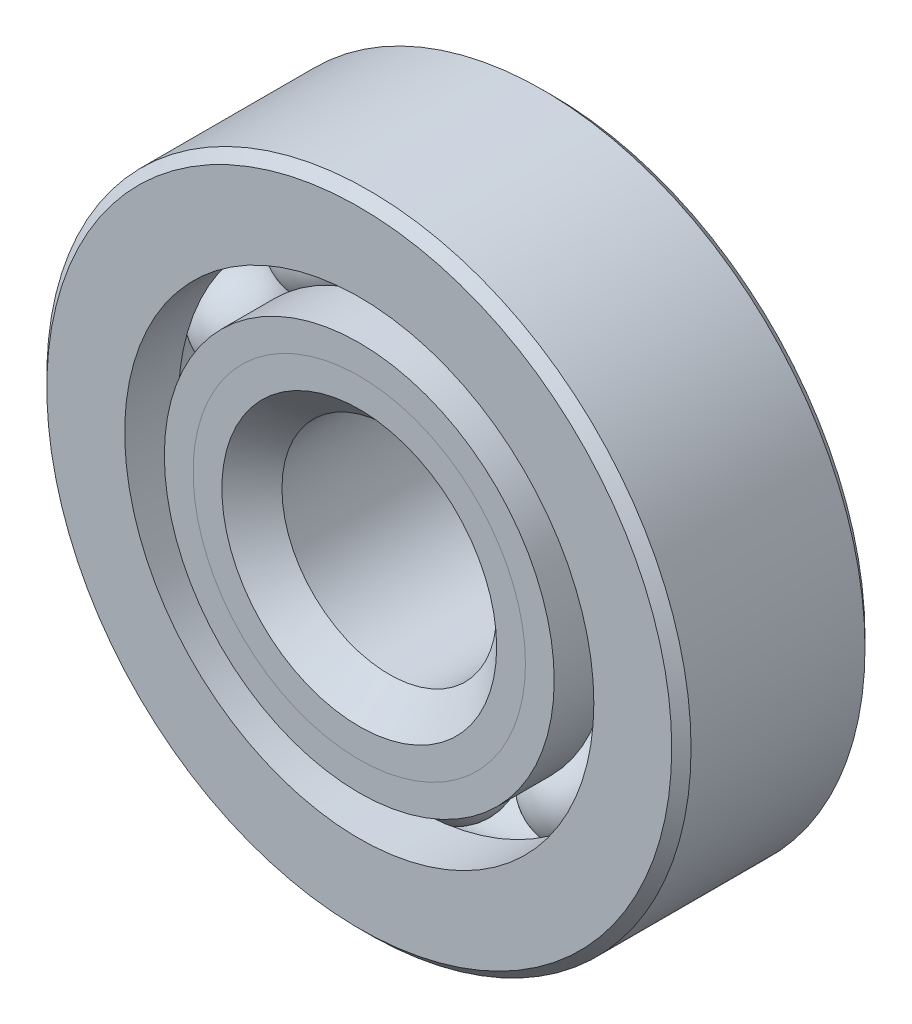
ISO-10303-21;
HEADER;
FILE_DESCRIPTION(('STEP AP214'),'2;1');
FILE_NAME('part.step','',(''),(''),'','','');
FILE_SCHEMA(('AUTOMOTIVE_DESIGN { 1 0 10303 214 1 1 1 1 }'));
ENDSEC;
DATA;
#1=APPLICATION_CONTEXT('core data for automotive mechanical design processes');
#2=APPLICATION_PROTOCOL_DEFINITION('international standard','automotive_design',2000,#1);
#3=PRODUCT_CONTEXT('',#1,'mechanical');
#4=PRODUCT('Part','Part','',(#3));
#5=PRODUCT_RELATED_PRODUCT_CATEGORY('part','',(#4));
#6=PRODUCT_DEFINITION_FORMATION('','',#4);
#7=PRODUCT_DEFINITION_CONTEXT('part definition',#1,'design');
#8=PRODUCT_DEFINITION('design','',#6,#7);
#9=PRODUCT_DEFINITION_SHAPE('','',#8);
#10=(LENGTH_UNIT() NAMED_UNIT(*) SI_UNIT(.MILLI.,.METRE.));
#11=(NAMED_UNIT(*) PLANE_ANGLE_UNIT() SI_UNIT($,.RADIAN.));
#12=(NAMED_UNIT(*) SI_UNIT($,.STERADIAN.) SOLID_ANGLE_UNIT());
#13=UNCERTAINTY_MEASURE_WITH_UNIT(LENGTH_MEASURE(1.E-05),#10,'distance_accuracy_value','');
#14=(GEOMETRIC_REPRESENTATION_CONTEXT(3) GLOBAL_UNCERTAINTY_ASSIGNED_CONTEXT((#13)) GLOBAL_UNIT_ASSIGNED_CONTEXT((#10,
#11,#12)) REPRESENTATION_CONTEXT('',''));
#15=CARTESIAN_POINT('',(0.,0.,0.));
#16=DIRECTION('',(0.,0.,1.));
#17=DIRECTION('',(1.,0.,0.));
#18=AXIS2_PLACEMENT_3D('',#15,#16,#17);
#19=CARTESIAN_POINT('',(-5.87785252292463,8.09016994374955,0.));
#20=DIRECTION('',(0.,0.,1.));
#21=DIRECTION('',(-0.587785252292462,0.809016994374955,0.));
#22=AXIS2_PLACEMENT_3D('',#19,#20,#21);
#23=SPHERICAL_SURFACE('',#22,2.20274170204251);
#24=CARTESIAN_POINT('',(-5.87785252292463,8.09016994374955,2.20274170204251));
#25=VERTEX_POINT('',#24);
#26=VERTEX_LOOP('',#25);
#27=FACE_BOUND('',#26,.T.);
#28=ADVANCED_FACE('F37',(#27),#23,.T.);
#29=CLOSED_SHELL('',(#28));
#30=MANIFOLD_SOLID_BREP('B2',#29);
#31=CARTESIAN_POINT('',(-9.5105651629515,3.09016994374958,0.));
#32=DIRECTION('',(0.,0.,1.));
#33=DIRECTION('',(-0.95105651629515,0.309016994374958,0.));
#34=AXIS2_PLACEMENT_3D('',#31,#32,#33);
#35=SPHERICAL_SURFACE('',#34,2.20274170204251);
#36=CARTESIAN_POINT('',(-9.5105651629515,3.09016994374958,2.20274170204251));
#37=VERTEX_POINT('',#36);
#38=VERTEX_LOOP('',#37);
#39=FACE_BOUND('',#38,.T.);
#40=ADVANCED_FACE('F68',(#39),#35,.T.);
#41=CLOSED_SHELL('',(#40));
#42=MANIFOLD_SOLID_BREP('B6',#41);
#43=CARTESIAN_POINT('',(-9.51056516295157,-3.09016994374938,0.));
#44=DIRECTION('',(0.,0.,1.));
#45=DIRECTION('',(-0.951056516295157,-0.309016994374938,0.));
#46=AXIS2_PLACEMENT_3D('',#43,#44,#45);
#47=SPHERICAL_SURFACE('',#46,2.20274170204251);
#48=CARTESIAN_POINT('',(-9.51056516295157,-3.09016994374938,2.20274170204251));
#49=VERTEX_POINT('',#48);
#50=VERTEX_LOOP('',#49);
#51=FACE_BOUND('',#50,.T.);
#52=ADVANCED_FACE('F99',(#51),#47,.T.);
#53=CLOSED_SHELL('',(#52));
#54=MANIFOLD_SOLID_BREP('B33',#53);
#55=CARTESIAN_POINT('',(-5.8778525229248,-8.09016994374942,0.));
#56=DIRECTION('',(0.,0.,1.));
#57=DIRECTION('',(-0.58778525229248,-0.809016994374942,0.));
#58=AXIS2_PLACEMENT_3D('',#55,#56,#57);
#59=SPHERICAL_SURFACE('',#58,2.20274170204251);
#60=CARTESIAN_POINT('',(-5.8778525229248,-8.09016994374942,2.20274170204251));
#61=VERTEX_POINT('',#60);
#62=VERTEX_LOOP('',#61);
#63=FACE_BOUND('',#62,.T.);
#64=ADVANCED_FACE('F130',(#63),#59,.T.);
#65=CLOSED_SHELL('',(#64));
#66=MANIFOLD_SOLID_BREP('B64',#65);
#67=CARTESIAN_POINT('',(0.,-10.,0.));
#68=DIRECTION('',(0.,0.,1.));
#69=DIRECTION('',(0.,-1.,0.));
#70=AXIS2_PLACEMENT_3D('',#67,#68,#69);
#71=SPHERICAL_SURFACE('',#70,2.20274170204251);
#72=CARTESIAN_POINT('',(0.,-10.,2.20274170204251));
#73=VERTEX_POINT('',#72);
#74=VERTEX_LOOP('',#73);
#75=FACE_BOUND('',#74,.T.);
#76=ADVANCED_FACE('F161',(#75),#71,.T.);
#77=CLOSED_SHELL('',(#76));
#78=MANIFOLD_SOLID_BREP('B95',#77);
#79=CARTESIAN_POINT('',(5.87785252292469,-8.09016994374951,0.));
#80=DIRECTION('',(0.,0.,1.));
#81=DIRECTION('',(0.587785252292469,-0.809016994374951,0.));
#82=AXIS2_PLACEMENT_3D('',#79,#80,#81);
#83=SPHERICAL_SURFACE('',#82,2.20274170204251);
#84=CARTESIAN_POINT('',(5.87785252292469,-8.09016994374951,2.20274170204251));
#85=VERTEX_POINT('',#84);
#86=VERTEX_LOOP('',#85);
#87=FACE_BOUND('',#86,.T.);
#88=ADVANCED_FACE('F192',(#87),#83,.T.);
#89=CLOSED_SHELL('',(#88));
#90=MANIFOLD_SOLID_BREP('B126',#89);
#91=CARTESIAN_POINT('',(9.51056516295152,-3.09016994374952,0.));
#92=DIRECTION('',(0.,0.,1.));
#93=DIRECTION('',(0.951056516295152,-0.309016994374952,0.));
#94=AXIS2_PLACEMENT_3D('',#91,#92,#93);
#95=SPHERICAL_SURFACE('',#94,2.20274170204251);
#96=CARTESIAN_POINT('',(9.51056516295152,-3.09016994374952,2.20274170204251));
#97=VERTEX_POINT('',#96);
#98=VERTEX_LOOP('',#97);
#99=FACE_BOUND('',#98,.T.);
#100=ADVANCED_FACE('F223',(#99),#95,.T.);
#101=CLOSED_SHELL('',(#100));
#102=MANIFOLD_SOLID_BREP('B157',#101);
#103=CARTESIAN_POINT('',(9.51056516295155,3.09016994374945,0.));
#104=DIRECTION('',(0.,0.,1.));
#105=DIRECTION('',(0.951056516295155,0.309016994374945,0.));
#106=AXIS2_PLACEMENT_3D('',#103,#104,#105);
#107=SPHERICAL_SURFACE('',#106,2.20274170204251);
#108=CARTESIAN_POINT('',(9.51056516295155,3.09016994374945,2.20274170204251));
#109=VERTEX_POINT('',#108);
#110=VERTEX_LOOP('',#109);
#111=FACE_BOUND('',#110,.T.);
#112=ADVANCED_FACE('F254',(#111),#107,.T.);
#113=CLOSED_SHELL('',(#112));
#114=MANIFOLD_SOLID_BREP('B188',#113);
#115=CARTESIAN_POINT('',(5.87785252292474,8.09016994374947,0.));
#116=DIRECTION('',(0.,0.,1.));
#117=DIRECTION('',(0.587785252292474,0.809016994374947,0.));
#118=AXIS2_PLACEMENT_3D('',#115,#116,#117);
#119=SPHERICAL_SURFACE('',#118,2.20274170204251);
#120=CARTESIAN_POINT('',(5.87785252292474,8.09016994374947,2.20274170204251));
#121=VERTEX_POINT('',#120);
#122=VERTEX_LOOP('',#121);
#123=FACE_BOUND('',#122,.T.);
#124=ADVANCED_FACE('F285',(#123),#119,.T.);
#125=CLOSED_SHELL('',(#124));
#126=MANIFOLD_SOLID_BREP('B219',#125);
#127=CARTESIAN_POINT('',(0.,10.,0.));
#128=DIRECTION('',(0.,0.,1.));
#129=DIRECTION('',(0.,1.,0.));
#130=AXIS2_PLACEMENT_3D('',#127,#128,#129);
#131=SPHERICAL_SURFACE('',#130,2.20274170204251);
#132=CARTESIAN_POINT('',(0.,10.,2.20274170204251));
#133=VERTEX_POINT('',#132);
#134=VERTEX_LOOP('',#133);
#135=FACE_BOUND('',#134,.T.);
#136=ADVANCED_FACE('F318',(#135),#131,.T.);
#137=CLOSED_SHELL('',(#136));
#138=MANIFOLD_SOLID_BREP('B250',#137);
#139=CARTESIAN_POINT('',(0.,7.73777611295091,4.5));
#140=DIRECTION('',(0.,0.,-1.));
#141=DIRECTION('',(-1.,0.,0.));
#142=AXIS2_PLACEMENT_3D('',#139,#140,#141);
#143=PLANE('',#142);
#144=CARTESIAN_POINT('',(0.,0.,4.5));
#145=DIRECTION('',(0.,0.,1.));
#146=DIRECTION('',(1.,0.,0.));
#147=AXIS2_PLACEMENT_3D('',#144,#145,#146);
#148=CIRCLE('',#147,6.39862914897874);
#149=CARTESIAN_POINT('',(6.39862914897874,0.,4.5));
#150=VERTEX_POINT('',#149);
#151=EDGE_CURVE('E372',#150,#150,#148,.T.);
#152=ORIENTED_EDGE('',*,*,#151,.F.);
#153=EDGE_LOOP('',(#152));
#154=FACE_BOUND('',#153,.T.);
#155=CARTESIAN_POINT('',(0.,0.,4.5));
#156=DIRECTION('',(0.,0.,1.));
#157=DIRECTION('',(1.,0.,0.));
#158=AXIS2_PLACEMENT_3D('',#155,#156,#157);
#159=CIRCLE('',#158,7.73777611295091);
#160=CARTESIAN_POINT('',(7.73777611295091,0.,4.5));
#161=VERTEX_POINT('',#160);
#162=EDGE_CURVE('E317',#161,#161,#159,.T.);
#163=ORIENTED_EDGE('',*,*,#162,.T.);
#164=EDGE_LOOP('',(#163));
#165=FACE_BOUND('',#164,.T.);
#166=ADVANCED_FACE('F338',(#154,#165),#143,.F.);
#167=CARTESIAN_POINT('',(0.,0.,3.16085303602784));
#168=DIRECTION('',(0.,0.,1.));
#169=DIRECTION('',(1.,0.,0.));
#170=AXIS2_PLACEMENT_3D('',#167,#168,#169);
#171=CONICAL_SURFACE('',#170,6.39862914897874,0.785398163397451);
#172=ORIENTED_EDGE('',*,*,#162,.F.);
#173=EDGE_LOOP('',(#172));
#174=FACE_BOUND('',#173,.T.);
#175=CARTESIAN_POINT('',(0.,0.,3.16085303602784));
#176=DIRECTION('',(0.,0.,1.));
#177=DIRECTION('',(1.,0.,0.));
#178=AXIS2_PLACEMENT_3D('',#175,#176,#177);
#179=CIRCLE('',#178,6.39862914897874);
#180=CARTESIAN_POINT('',(6.39862914897874,0.,3.16085303602784));
#181=VERTEX_POINT('',#180);
#182=EDGE_CURVE('E344',#181,#181,#179,.T.);
#183=ORIENTED_EDGE('',*,*,#182,.T.);
#184=EDGE_LOOP('',(#183));
#185=FACE_BOUND('',#184,.T.);
#186=ADVANCED_FACE('F379',(#174,#185),#171,.T.);
#187=CARTESIAN_POINT('',(0.,0.,4.5));
#188=DIRECTION('',(0.,0.,1.));
#189=DIRECTION('',(1.,0.,0.));
#190=AXIS2_PLACEMENT_3D('',#187,#188,#189);
#191=CYLINDRICAL_SURFACE('',#190,6.39862914897874);
#192=ORIENTED_EDGE('',*,*,#182,.F.);
#193=EDGE_LOOP('',(#192));
#194=FACE_BOUND('',#193,.T.);
#195=CARTESIAN_POINT('',(0.,0.,0.));
#196=DIRECTION('',(0.,0.,1.));
#197=DIRECTION('',(1.,0.,0.));
#198=AXIS2_PLACEMENT_3D('',#195,#196,#197);
#199=CIRCLE('',#198,6.39862914897874);
#200=CARTESIAN_POINT('',(6.39862914897874,0.,0.));
#201=VERTEX_POINT('',#200);
#202=EDGE_CURVE('E348',#201,#201,#199,.T.);
#203=ORIENTED_EDGE('',*,*,#202,.T.);
#204=EDGE_LOOP('',(#203));
#205=FACE_BOUND('',#204,.T.);
#206=ADVANCED_FACE('F383',(#194,#205),#191,.T.);
#207=CARTESIAN_POINT('',(0.,6.39862914897874,0.));
#208=DIRECTION('',(0.,0.,-1.));
#209=DIRECTION('',(-1.,0.,0.));
#210=AXIS2_PLACEMENT_3D('',#207,#208,#209);
#211=PLANE('',#210);
#212=ORIENTED_EDGE('',*,*,#202,.F.);
#213=EDGE_LOOP('',(#212));
#214=FACE_BOUND('',#213,.T.);
#215=CARTESIAN_POINT('',(0.,0.,0.));
#216=DIRECTION('',(0.,0.,1.));
#217=DIRECTION('',(1.,0.,0.));
#218=AXIS2_PLACEMENT_3D('',#215,#216,#217);
#219=CIRCLE('',#218,7.79725829795749);
#220=CARTESIAN_POINT('',(7.79725829795749,0.,0.));
#221=VERTEX_POINT('',#220);
#222=EDGE_CURVE('E352',#221,#221,#219,.T.);
#223=ORIENTED_EDGE('',*,*,#222,.T.);
#224=EDGE_LOOP('',(#223));
#225=FACE_BOUND('',#224,.T.);
#226=ADVANCED_FACE('F388',(#214,#225),#211,.F.);
#227=CARTESIAN_POINT('',(0.,0.,0.));
#228=DIRECTION('',(0.,0.,1.));
#229=DIRECTION('',(1.,0.,0.));
#230=AXIS2_PLACEMENT_3D('',#227,#228,#229);
#231=TOROIDAL_SURFACE('',#230,10.,2.20274170204251);
#232=ORIENTED_EDGE('',*,*,#222,.F.);
#233=EDGE_LOOP('',(#232));
#234=FACE_BOUND('',#233,.T.);
#235=CARTESIAN_POINT('',(0.,0.,-2.));
#236=DIRECTION('',(0.,0.,1.));
#237=DIRECTION('',(1.,0.,0.));
#238=AXIS2_PLACEMENT_3D('',#235,#236,#237);
#239=CIRCLE('',#238,9.07692307692308);
#240=CARTESIAN_POINT('',(9.07692307692308,0.,-2.));
#241=VERTEX_POINT('',#240);
#242=EDGE_CURVE('E357',#241,#241,#239,.T.);
#243=ORIENTED_EDGE('',*,*,#242,.T.);
#244=EDGE_LOOP('',(#243));
#245=FACE_BOUND('',#244,.T.);
#246=ADVANCED_FACE('F394',(#234,#245),#231,.F.);
#247=CARTESIAN_POINT('',(0.,0.,4.5));
#248=DIRECTION('',(0.,0.,1.));
#249=DIRECTION('',(1.,0.,0.));
#250=AXIS2_PLACEMENT_3D('',#247,#248,#249);
#251=CYLINDRICAL_SURFACE('',#250,9.07692307692308);
#252=ORIENTED_EDGE('',*,*,#242,.F.);
#253=EDGE_LOOP('',(#252));
#254=FACE_BOUND('',#253,.T.);
#255=CARTESIAN_POINT('',(0.,0.,-4.5));
#256=DIRECTION('',(0.,0.,1.));
#257=DIRECTION('',(1.,0.,0.));
#258=AXIS2_PLACEMENT_3D('',#255,#256,#257);
#259=CIRCLE('',#258,9.07692307692308);
#260=CARTESIAN_POINT('',(9.07692307692308,0.,-4.5));
#261=VERTEX_POINT('',#260);
#262=EDGE_CURVE('E360',#261,#261,#259,.T.);
#263=ORIENTED_EDGE('',*,*,#262,.T.);
#264=EDGE_LOOP('',(#263));
#265=FACE_BOUND('',#264,.T.);
#266=ADVANCED_FACE('F398',(#254,#265),#251,.T.);
#267=CARTESIAN_POINT('',(0.,5.45,-4.50000000000001));
#268=DIRECTION('',(0.,0.,1.));
#269=DIRECTION('',(1.,0.,0.));
#270=AXIS2_PLACEMENT_3D('',#267,#268,#269);
#271=PLANE('',#270);
#272=ORIENTED_EDGE('',*,*,#262,.F.);
#273=EDGE_LOOP('',(#272));
#274=FACE_BOUND('',#273,.T.);
#275=CARTESIAN_POINT('',(0.,0.,-4.50000000000001));
#276=DIRECTION('',(0.,0.,1.));
#277=DIRECTION('',(1.,0.,0.));
#278=AXIS2_PLACEMENT_3D('',#275,#276,#277);
#279=CIRCLE('',#278,5.45);
#280=CARTESIAN_POINT('',(5.45,0.,-4.50000000000001));
#281=VERTEX_POINT('',#280);
#282=EDGE_CURVE('E363',#281,#281,#279,.T.);
#283=ORIENTED_EDGE('',*,*,#282,.T.);
#284=EDGE_LOOP('',(#283));
#285=FACE_BOUND('',#284,.T.);
#286=ADVANCED_FACE('F402',(#274,#285),#271,.F.);
#287=CARTESIAN_POINT('',(0.,0.,-4.05000000000001));
#288=DIRECTION('',(0.,0.,-1.));
#289=DIRECTION('',(-1.,0.,0.));
#290=AXIS2_PLACEMENT_3D('',#287,#288,#289);
#291=CONICAL_SURFACE('',#290,5.,0.785398163397445);
#292=ORIENTED_EDGE('',*,*,#282,.F.);
#293=EDGE_LOOP('',(#292));
#294=FACE_BOUND('',#293,.T.);
#295=CARTESIAN_POINT('',(0.,0.,-4.05000000000001));
#296=DIRECTION('',(0.,0.,1.));
#297=DIRECTION('',(1.,0.,0.));
#298=AXIS2_PLACEMENT_3D('',#295,#296,#297);
#299=CIRCLE('',#298,5.);
#300=CARTESIAN_POINT('',(5.,0.,-4.05000000000001));
#301=VERTEX_POINT('',#300);
#302=EDGE_CURVE('E366',#301,#301,#299,.T.);
#303=ORIENTED_EDGE('',*,*,#302,.T.);
#304=EDGE_LOOP('',(#303));
#305=FACE_BOUND('',#304,.T.);
#306=ADVANCED_FACE('F406',(#294,#305),#291,.F.);
#307=CARTESIAN_POINT('',(0.,0.,4.5));
#308=DIRECTION('',(0.,0.,1.));
#309=DIRECTION('',(1.,0.,0.));
#310=AXIS2_PLACEMENT_3D('',#307,#308,#309);
#311=CYLINDRICAL_SURFACE('',#310,5.);
#312=ORIENTED_EDGE('',*,*,#302,.F.);
#313=EDGE_LOOP('',(#312));
#314=FACE_BOUND('',#313,.T.);
#315=CARTESIAN_POINT('',(0.,0.,3.10137085102126));
#316=DIRECTION('',(0.,0.,1.));
#317=DIRECTION('',(1.,0.,0.));
#318=AXIS2_PLACEMENT_3D('',#315,#316,#317);
#319=CIRCLE('',#318,5.);
#320=CARTESIAN_POINT('',(5.,0.,3.10137085102126));
#321=VERTEX_POINT('',#320);
#322=EDGE_CURVE('E369',#321,#321,#319,.T.);
#323=ORIENTED_EDGE('',*,*,#322,.T.);
#324=EDGE_LOOP('',(#323));
#325=FACE_BOUND('',#324,.T.);
#326=ADVANCED_FACE('F410',(#314,#325),#311,.F.);
#327=CARTESIAN_POINT('',(0.,0.,4.5));
#328=DIRECTION('',(0.,0.,1.));
#329=DIRECTION('',(1.,0.,0.));
#330=AXIS2_PLACEMENT_3D('',#327,#328,#329);
#331=CONICAL_SURFACE('',#330,6.39862914897874,0.78539816339745);
#332=ORIENTED_EDGE('',*,*,#322,.F.);
#333=EDGE_LOOP('',(#332));
#334=FACE_BOUND('',#333,.T.);
#335=ORIENTED_EDGE('',*,*,#151,.T.);
#336=EDGE_LOOP('',(#335));
#337=FACE_BOUND('',#336,.T.);
#338=ADVANCED_FACE('F376',(#334,#337),#331,.F.);
#339=CLOSED_SHELL('',(#166,#186,#206,#226,#246,#266,#286,#306,#326,#338));
#340=MANIFOLD_SOLID_BREP('B281',#339);
#341=CARTESIAN_POINT('',(0.,9.07692307692308,4.5));
#342=DIRECTION('',(0.,0.,-1.));
#343=DIRECTION('',(-1.,0.,0.));
#344=AXIS2_PLACEMENT_3D('',#341,#342,#343);
#345=PLANE('',#344);
#346=CARTESIAN_POINT('',(0.,0.,4.5));
#347=DIRECTION('',(0.,0.,1.));
#348=DIRECTION('',(1.,0.,0.));
#349=AXIS2_PLACEMENT_3D('',#346,#347,#348);
#350=CIRCLE('',#349,7.73777611295091);
#351=CARTESIAN_POINT('',(7.73777611295091,0.,4.5));
#352=VERTEX_POINT('',#351);
#353=EDGE_CURVE('E337',#352,#352,#350,.T.);
#354=ORIENTED_EDGE('',*,*,#353,.F.);
#355=EDGE_LOOP('',(#354));
#356=FACE_BOUND('',#355,.T.);
#357=CARTESIAN_POINT('',(0.,0.,4.5));
#358=DIRECTION('',(0.,0.,1.));
#359=DIRECTION('',(1.,0.,0.));
#360=AXIS2_PLACEMENT_3D('',#357,#358,#359);
#361=CIRCLE('',#360,9.07692307692308);
#362=CARTESIAN_POINT('',(9.07692307692308,0.,4.5));
#363=VERTEX_POINT('',#362);
#364=EDGE_CURVE('E518',#363,#363,#361,.T.);
#365=ORIENTED_EDGE('',*,*,#364,.T.);
#366=EDGE_LOOP('',(#365));
#367=FACE_BOUND('',#366,.T.);
#368=ADVANCED_FACE('F496',(#356,#367),#345,.F.);
#369=CARTESIAN_POINT('',(0.,0.,4.5));
#370=DIRECTION('',(0.,0.,1.));
#371=DIRECTION('',(1.,0.,0.));
#372=AXIS2_PLACEMENT_3D('',#369,#370,#371);
#373=CONICAL_SURFACE('',#372,7.73777611295091,0.785398163397451);
#374=CARTESIAN_POINT('',(0.,0.,3.16085303602784));
#375=DIRECTION('',(0.,0.,1.));
#376=DIRECTION('',(1.,0.,0.));
#377=AXIS2_PLACEMENT_3D('',#374,#375,#376);
#378=CIRCLE('',#377,6.39862914897874);
#379=CARTESIAN_POINT('',(6.39862914897874,0.,3.16085303602784));
#380=VERTEX_POINT('',#379);
#381=EDGE_CURVE('E502',#380,#380,#378,.T.);
#382=ORIENTED_EDGE('',*,*,#381,.F.);
#383=EDGE_LOOP('',(#382));
#384=FACE_BOUND('',#383,.T.);
#385=ORIENTED_EDGE('',*,*,#353,.T.);
#386=EDGE_LOOP('',(#385));
#387=FACE_BOUND('',#386,.T.);
#388=ADVANCED_FACE('F543',(#384,#387),#373,.F.);
#389=CARTESIAN_POINT('',(0.,0.,4.5));
#390=DIRECTION('',(0.,0.,1.));
#391=DIRECTION('',(1.,0.,0.));
#392=AXIS2_PLACEMENT_3D('',#389,#390,#391);
#393=CYLINDRICAL_SURFACE('',#392,6.39862914897874);
#394=CARTESIAN_POINT('',(0.,0.,0.));
#395=DIRECTION('',(0.,0.,1.));
#396=DIRECTION('',(1.,0.,0.));
#397=AXIS2_PLACEMENT_3D('',#394,#395,#396);
#398=CIRCLE('',#397,6.39862914897874);
#399=CARTESIAN_POINT('',(6.39862914897874,0.,0.));
#400=VERTEX_POINT('',#399);
#401=EDGE_CURVE('E506',#400,#400,#398,.T.);
#402=ORIENTED_EDGE('',*,*,#401,.F.);
#403=EDGE_LOOP('',(#402));
#404=FACE_BOUND('',#403,.T.);
#405=ORIENTED_EDGE('',*,*,#381,.T.);
#406=EDGE_LOOP('',(#405));
#407=FACE_BOUND('',#406,.T.);
#408=ADVANCED_FACE('F538',(#404,#407),#393,.F.);
#409=CARTESIAN_POINT('',(0.,6.39862914897874,0.));
#410=DIRECTION('',(0.,0.,1.));
#411=DIRECTION('',(1.,0.,0.));
#412=AXIS2_PLACEMENT_3D('',#409,#410,#411);
#413=PLANE('',#412);
#414=CARTESIAN_POINT('',(0.,0.,0.));
#415=DIRECTION('',(0.,0.,1.));
#416=DIRECTION('',(1.,0.,0.));
#417=AXIS2_PLACEMENT_3D('',#414,#415,#416);
#418=CIRCLE('',#417,7.79725829795749);
#419=CARTESIAN_POINT('',(7.79725829795749,0.,0.));
#420=VERTEX_POINT('',#419);
#421=EDGE_CURVE('E510',#420,#420,#418,.T.);
#422=ORIENTED_EDGE('',*,*,#421,.F.);
#423=EDGE_LOOP('',(#422));
#424=FACE_BOUND('',#423,.T.);
#425=ORIENTED_EDGE('',*,*,#401,.T.);
#426=EDGE_LOOP('',(#425));
#427=FACE_BOUND('',#426,.T.);
#428=ADVANCED_FACE('F532',(#424,#427),#413,.F.);
#429=CARTESIAN_POINT('',(0.,0.,0.));
#430=DIRECTION('',(0.,0.,1.));
#431=DIRECTION('',(1.,0.,0.));
#432=AXIS2_PLACEMENT_3D('',#429,#430,#431);
#433=TOROIDAL_SURFACE('',#432,10.,2.20274170204251);
#434=CARTESIAN_POINT('',(0.,0.,2.));
#435=DIRECTION('',(0.,0.,1.));
#436=DIRECTION('',(1.,0.,0.));
#437=AXIS2_PLACEMENT_3D('',#434,#435,#436);
#438=CIRCLE('',#437,9.07692307692308);
#439=CARTESIAN_POINT('',(9.07692307692308,0.,2.));
#440=VERTEX_POINT('',#439);
#441=EDGE_CURVE('E515',#440,#440,#438,.T.);
#442=ORIENTED_EDGE('',*,*,#441,.F.);
#443=EDGE_LOOP('',(#442));
#444=FACE_BOUND('',#443,.T.);
#445=ORIENTED_EDGE('',*,*,#421,.T.);
#446=EDGE_LOOP('',(#445));
#447=FACE_BOUND('',#446,.T.);
#448=ADVANCED_FACE('F526',(#444,#447),#433,.F.);
#449=CARTESIAN_POINT('',(0.,0.,4.5));
#450=DIRECTION('',(0.,0.,1.));
#451=DIRECTION('',(1.,0.,0.));
#452=AXIS2_PLACEMENT_3D('',#449,#450,#451);
#453=CYLINDRICAL_SURFACE('',#452,9.07692307692308);
#454=ORIENTED_EDGE('',*,*,#364,.F.);
#455=EDGE_LOOP('',(#454));
#456=FACE_BOUND('',#455,.T.);
#457=ORIENTED_EDGE('',*,*,#441,.T.);
#458=EDGE_LOOP('',(#457));
#459=FACE_BOUND('',#458,.T.);
#460=ADVANCED_FACE('F523',(#456,#459),#453,.T.);
#461=CLOSED_SHELL('',(#368,#388,#408,#428,#448,#460));
#462=MANIFOLD_SOLID_BREP('B312',#461);
#463=CARTESIAN_POINT('',(0.,0.,4.05));
#464=DIRECTION('',(0.,0.,-1.));
#465=DIRECTION('',(-1.,0.,0.));
#466=AXIS2_PLACEMENT_3D('',#463,#464,#465);
#467=CONICAL_SURFACE('',#466,15.,0.785398163397446);
#468=CARTESIAN_POINT('',(0.,0.,4.5));
#469=DIRECTION('',(0.,0.,1.));
#470=DIRECTION('',(1.,0.,0.));
#471=AXIS2_PLACEMENT_3D('',#468,#469,#470);
#472=CIRCLE('',#471,14.55);
#473=CARTESIAN_POINT('',(14.55,0.,4.5));
#474=VERTEX_POINT('',#473);
#475=EDGE_CURVE('E615',#474,#474,#472,.T.);
#476=ORIENTED_EDGE('',*,*,#475,.F.);
#477=EDGE_LOOP('',(#476));
#478=FACE_BOUND('',#477,.T.);
#479=CARTESIAN_POINT('',(0.,0.,4.05));
#480=DIRECTION('',(0.,0.,1.));
#481=DIRECTION('',(1.,0.,0.));
#482=AXIS2_PLACEMENT_3D('',#479,#480,#481);
#483=CIRCLE('',#482,15.);
#484=CARTESIAN_POINT('',(15.,0.,4.05));
#485=VERTEX_POINT('',#484);
#486=EDGE_CURVE('E495',#485,#485,#483,.T.);
#487=ORIENTED_EDGE('',*,*,#486,.T.);
#488=EDGE_LOOP('',(#487));
#489=FACE_BOUND('',#488,.T.);
#490=ADVANCED_FACE('F587',(#478,#489),#467,.T.);
#491=CARTESIAN_POINT('',(0.,0.,4.5));
#492=DIRECTION('',(0.,0.,1.));
#493=DIRECTION('',(1.,0.,0.));
#494=AXIS2_PLACEMENT_3D('',#491,#492,#493);
#495=CYLINDRICAL_SURFACE('',#494,15.);
#496=ORIENTED_EDGE('',*,*,#486,.F.);
#497=EDGE_LOOP('',(#496));
#498=FACE_BOUND('',#497,.T.);
#499=CARTESIAN_POINT('',(0.,0.,-4.05000000000001));
#500=DIRECTION('',(0.,0.,1.));
#501=DIRECTION('',(1.,0.,0.));
#502=AXIS2_PLACEMENT_3D('',#499,#500,#501);
#503=CIRCLE('',#502,15.);
#504=CARTESIAN_POINT('',(15.,0.,-4.05000000000001));
#505=VERTEX_POINT('',#504);
#506=EDGE_CURVE('E593',#505,#505,#503,.T.);
#507=ORIENTED_EDGE('',*,*,#506,.T.);
#508=EDGE_LOOP('',(#507));
#509=FACE_BOUND('',#508,.T.);
#510=ADVANCED_FACE('F622',(#498,#509),#495,.T.);
#511=CARTESIAN_POINT('',(0.,0.,-4.5));
#512=DIRECTION('',(0.,0.,1.));
#513=DIRECTION('',(1.,0.,0.));
#514=AXIS2_PLACEMENT_3D('',#511,#512,#513);
#515=CONICAL_SURFACE('',#514,14.55,0.785398163397448);
#516=ORIENTED_EDGE('',*,*,#506,.F.);
#517=EDGE_LOOP('',(#516));
#518=FACE_BOUND('',#517,.T.);
#519=CARTESIAN_POINT('',(0.,0.,-4.5));
#520=DIRECTION('',(0.,0.,1.));
#521=DIRECTION('',(1.,0.,0.));
#522=AXIS2_PLACEMENT_3D('',#519,#520,#521);
#523=CIRCLE('',#522,14.55);
#524=CARTESIAN_POINT('',(14.55,0.,-4.5));
#525=VERTEX_POINT('',#524);
#526=EDGE_CURVE('E597',#525,#525,#523,.T.);
#527=ORIENTED_EDGE('',*,*,#526,.T.);
#528=EDGE_LOOP('',(#527));
#529=FACE_BOUND('',#528,.T.);
#530=ADVANCED_FACE('F626',(#518,#529),#515,.T.);
#531=CARTESIAN_POINT('',(0.,14.55,-4.50000000000001));
#532=DIRECTION('',(0.,0.,1.));
#533=DIRECTION('',(1.,0.,0.));
#534=AXIS2_PLACEMENT_3D('',#531,#532,#533);
#535=PLANE('',#534);
#536=ORIENTED_EDGE('',*,*,#526,.F.);
#537=EDGE_LOOP('',(#536));
#538=FACE_BOUND('',#537,.T.);
#539=CARTESIAN_POINT('',(0.,0.,-4.5));
#540=DIRECTION('',(0.,0.,1.));
#541=DIRECTION('',(1.,0.,0.));
#542=AXIS2_PLACEMENT_3D('',#539,#540,#541);
#543=CIRCLE('',#542,10.9230769230769);
#544=CARTESIAN_POINT('',(10.9230769230769,0.,-4.5));
#545=VERTEX_POINT('',#544);
#546=EDGE_CURVE('E601',#545,#545,#543,.T.);
#547=ORIENTED_EDGE('',*,*,#546,.T.);
#548=EDGE_LOOP('',(#547));
#549=FACE_BOUND('',#548,.T.);
#550=ADVANCED_FACE('F631',(#538,#549),#535,.F.);
#551=CARTESIAN_POINT('',(0.,0.,4.5));
#552=DIRECTION('',(0.,0.,1.));
#553=DIRECTION('',(1.,0.,0.));
#554=AXIS2_PLACEMENT_3D('',#551,#552,#553);
#555=CYLINDRICAL_SURFACE('',#554,10.9230769230769);
#556=ORIENTED_EDGE('',*,*,#546,.F.);
#557=EDGE_LOOP('',(#556));
#558=FACE_BOUND('',#557,.T.);
#559=CARTESIAN_POINT('',(0.,0.,-2.));
#560=DIRECTION('',(0.,0.,1.));
#561=DIRECTION('',(1.,0.,0.));
#562=AXIS2_PLACEMENT_3D('',#559,#560,#561);
#563=CIRCLE('',#562,10.9230769230769);
#564=CARTESIAN_POINT('',(10.9230769230769,0.,-2.));
#565=VERTEX_POINT('',#564);
#566=EDGE_CURVE('E606',#565,#565,#563,.T.);
#567=ORIENTED_EDGE('',*,*,#566,.T.);
#568=EDGE_LOOP('',(#567));
#569=FACE_BOUND('',#568,.T.);
#570=ADVANCED_FACE('F637',(#558,#569),#555,.F.);
#571=CARTESIAN_POINT('',(0.,0.,0.));
#572=DIRECTION('',(0.,0.,1.));
#573=DIRECTION('',(1.,0.,0.));
#574=AXIS2_PLACEMENT_3D('',#571,#572,#573);
#575=TOROIDAL_SURFACE('',#574,10.,2.20274170204251);
#576=ORIENTED_EDGE('',*,*,#566,.F.);
#577=EDGE_LOOP('',(#576));
#578=FACE_BOUND('',#577,.T.);
#579=CARTESIAN_POINT('',(0.,0.,2.));
#580=DIRECTION('',(0.,0.,1.));
#581=DIRECTION('',(1.,0.,0.));
#582=AXIS2_PLACEMENT_3D('',#579,#580,#581);
#583=CIRCLE('',#582,10.9230769230769);
#584=CARTESIAN_POINT('',(10.9230769230769,0.,2.));
#585=VERTEX_POINT('',#584);
#586=EDGE_CURVE('E609',#585,#585,#583,.T.);
#587=ORIENTED_EDGE('',*,*,#586,.T.);
#588=EDGE_LOOP('',(#587));
#589=FACE_BOUND('',#588,.T.);
#590=ADVANCED_FACE('F641',(#578,#589),#575,.F.);
#591=CARTESIAN_POINT('',(0.,0.,4.5));
#592=DIRECTION('',(0.,0.,1.));
#593=DIRECTION('',(1.,0.,0.));
#594=AXIS2_PLACEMENT_3D('',#591,#592,#593);
#595=CYLINDRICAL_SURFACE('',#594,10.9230769230769);
#596=ORIENTED_EDGE('',*,*,#586,.F.);
#597=EDGE_LOOP('',(#596));
#598=FACE_BOUND('',#597,.T.);
#599=CARTESIAN_POINT('',(0.,0.,4.5));
#600=DIRECTION('',(0.,0.,1.));
#601=DIRECTION('',(1.,0.,0.));
#602=AXIS2_PLACEMENT_3D('',#599,#600,#601);
#603=CIRCLE('',#602,10.9230769230769);
#604=CARTESIAN_POINT('',(10.9230769230769,0.,4.5));
#605=VERTEX_POINT('',#604);
#606=EDGE_CURVE('E612',#605,#605,#603,.T.);
#607=ORIENTED_EDGE('',*,*,#606,.T.);
#608=EDGE_LOOP('',(#607));
#609=FACE_BOUND('',#608,.T.);
#610=ADVANCED_FACE('F645',(#598,#609),#595,.F.);
#611=CARTESIAN_POINT('',(0.,14.55,4.5));
#612=DIRECTION('',(0.,0.,-1.));
#613=DIRECTION('',(-1.,0.,0.));
#614=AXIS2_PLACEMENT_3D('',#611,#612,#613);
#615=PLANE('',#614);
#616=ORIENTED_EDGE('',*,*,#606,.F.);
#617=EDGE_LOOP('',(#616));
#618=FACE_BOUND('',#617,.T.);
#619=ORIENTED_EDGE('',*,*,#475,.T.);
#620=EDGE_LOOP('',(#619));
#621=FACE_BOUND('',#620,.T.);
#622=ADVANCED_FACE('F619',(#618,#621),#615,.F.);
#623=CLOSED_SHELL('',(#490,#510,#530,#550,#570,#590,#610,#622));
#624=MANIFOLD_SOLID_BREP('B332',#623);
#625=ADVANCED_BREP_SHAPE_REPRESENTATION('',(#18,#30,#42,#54,#66,#78,#90,#102,#114,#126,#138,
#340,#462,#624),#14);
#626=SHAPE_DEFINITION_REPRESENTATION(#9,#625);
ENDSEC;
END-ISO-10303-21;
